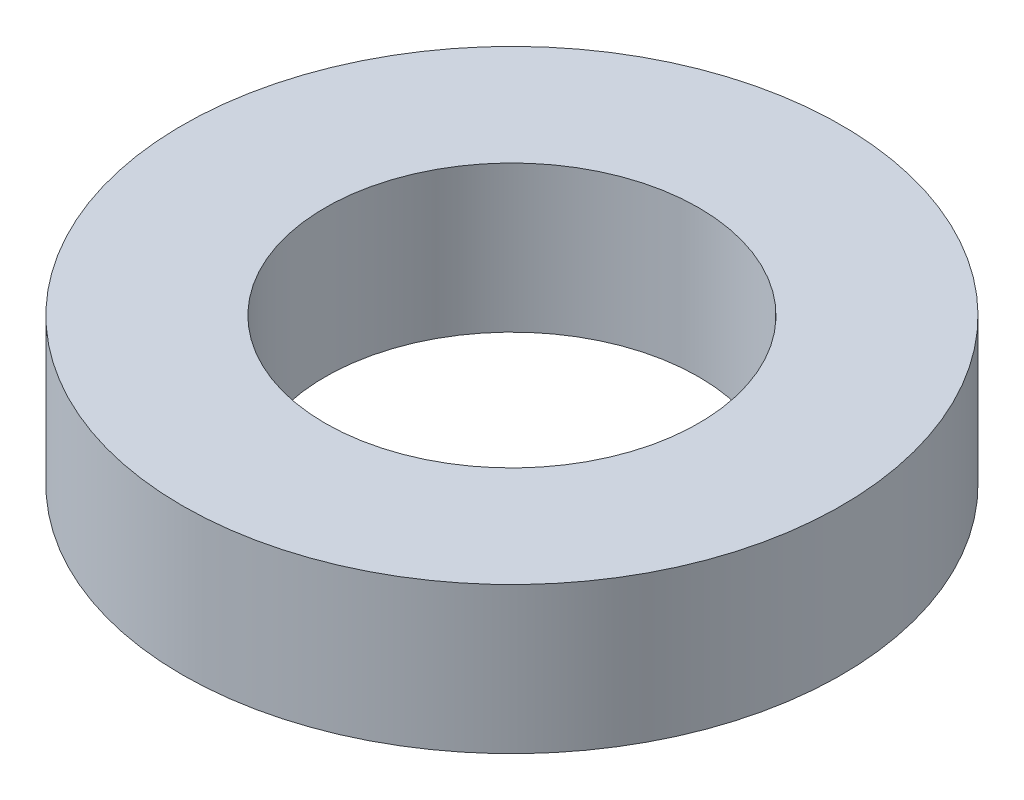
ISO-10303-21;
HEADER;
FILE_DESCRIPTION(('STEP AP214'),'2;1');
FILE_NAME('part.step','',(''),(''),'','','');
FILE_SCHEMA(('AUTOMOTIVE_DESIGN { 1 0 10303 214 1 1 1 1 }'));
ENDSEC;
DATA;
#1=APPLICATION_CONTEXT('core data for automotive mechanical design processes');
#2=APPLICATION_PROTOCOL_DEFINITION('international standard','automotive_design',2000,#1);
#3=PRODUCT_CONTEXT('',#1,'mechanical');
#4=PRODUCT('Part','Part','',(#3));
#5=PRODUCT_RELATED_PRODUCT_CATEGORY('part','',(#4));
#6=PRODUCT_DEFINITION_FORMATION('','',#4);
#7=PRODUCT_DEFINITION_CONTEXT('part definition',#1,'design');
#8=PRODUCT_DEFINITION('design','',#6,#7);
#9=PRODUCT_DEFINITION_SHAPE('','',#8);
#10=(LENGTH_UNIT() NAMED_UNIT(*) SI_UNIT(.MILLI.,.METRE.));
#11=(NAMED_UNIT(*) PLANE_ANGLE_UNIT() SI_UNIT($,.RADIAN.));
#12=(NAMED_UNIT(*) SI_UNIT($,.STERADIAN.) SOLID_ANGLE_UNIT());
#13=UNCERTAINTY_MEASURE_WITH_UNIT(LENGTH_MEASURE(1.E-05),#10,'distance_accuracy_value','');
#14=(GEOMETRIC_REPRESENTATION_CONTEXT(3) GLOBAL_UNCERTAINTY_ASSIGNED_CONTEXT((#13)) GLOBAL_UNIT_ASSIGNED_CONTEXT((#10,
#11,#12)) REPRESENTATION_CONTEXT('',''));
#15=CARTESIAN_POINT('',(0.,0.,0.));
#16=DIRECTION('',(0.,0.,1.));
#17=DIRECTION('',(1.,0.,0.));
#18=AXIS2_PLACEMENT_3D('',#15,#16,#17);
#19=CARTESIAN_POINT('',(0.,2.,0.));
#20=DIRECTION('',(0.,1.,0.));
#21=DIRECTION('',(0.,0.,1.));
#22=AXIS2_PLACEMENT_3D('',#19,#20,#21);
#23=PLANE('',#22);
#24=CARTESIAN_POINT('',(0.,2.,0.));
#25=DIRECTION('',(0.,1.,0.));
#26=DIRECTION('',(0.,0.,1.));
#27=AXIS2_PLACEMENT_3D('',#24,#25,#26);
#28=CIRCLE('',#27,4.5);
#29=CARTESIAN_POINT('',(0.,2.,4.5));
#30=VERTEX_POINT('',#29);
#31=EDGE_CURVE('E10',#30,#30,#28,.T.);
#32=ORIENTED_EDGE('',*,*,#31,.T.);
#33=EDGE_LOOP('',(#32));
#34=FACE_BOUND('',#33,.T.);
#35=CARTESIAN_POINT('',(0.,2.,0.));
#36=DIRECTION('',(0.,1.,0.));
#37=DIRECTION('',(0.,0.,1.));
#38=AXIS2_PLACEMENT_3D('',#35,#36,#37);
#39=CIRCLE('',#38,2.55);
#40=CARTESIAN_POINT('',(0.,2.,2.55));
#41=VERTEX_POINT('',#40);
#42=EDGE_CURVE('E50',#41,#41,#39,.T.);
#43=ORIENTED_EDGE('',*,*,#42,.F.);
#44=EDGE_LOOP('',(#43));
#45=FACE_BOUND('',#44,.T.);
#46=ADVANCED_FACE('F39',(#34,#45),#23,.T.);
#47=CARTESIAN_POINT('',(0.,0.,0.));
#48=DIRECTION('',(0.,1.,0.));
#49=DIRECTION('',(0.,0.,1.));
#50=AXIS2_PLACEMENT_3D('',#47,#48,#49);
#51=PLANE('',#50);
#52=CARTESIAN_POINT('',(0.,0.,0.));
#53=DIRECTION('',(0.,1.,0.));
#54=DIRECTION('',(0.,0.,1.));
#55=AXIS2_PLACEMENT_3D('',#52,#53,#54);
#56=CIRCLE('',#55,4.5);
#57=CARTESIAN_POINT('',(0.,0.,4.5));
#58=VERTEX_POINT('',#57);
#59=EDGE_CURVE('E43',#58,#58,#56,.T.);
#60=ORIENTED_EDGE('',*,*,#59,.F.);
#61=EDGE_LOOP('',(#60));
#62=FACE_BOUND('',#61,.T.);
#63=CARTESIAN_POINT('',(0.,0.,0.));
#64=DIRECTION('',(0.,1.,0.));
#65=DIRECTION('',(0.,0.,1.));
#66=AXIS2_PLACEMENT_3D('',#63,#64,#65);
#67=CIRCLE('',#66,2.55);
#68=CARTESIAN_POINT('',(0.,0.,2.55));
#69=VERTEX_POINT('',#68);
#70=EDGE_CURVE('E52',#69,#69,#67,.T.);
#71=ORIENTED_EDGE('',*,*,#70,.T.);
#72=EDGE_LOOP('',(#71));
#73=FACE_BOUND('',#72,.T.);
#74=ADVANCED_FACE('F62',(#62,#73),#51,.F.);
#75=CARTESIAN_POINT('',(0.,2.,0.));
#76=DIRECTION('',(0.,-1.,0.));
#77=DIRECTION('',(0.,0.,-1.));
#78=AXIS2_PLACEMENT_3D('',#75,#76,#77);
#79=CYLINDRICAL_SURFACE('',#78,4.5);
#80=ORIENTED_EDGE('',*,*,#31,.F.);
#81=EDGE_LOOP('',(#80));
#82=FACE_BOUND('',#81,.T.);
#83=ORIENTED_EDGE('',*,*,#59,.T.);
#84=EDGE_LOOP('',(#83));
#85=FACE_BOUND('',#84,.T.);
#86=ADVANCED_FACE('F41',(#82,#85),#79,.T.);
#87=CARTESIAN_POINT('',(0.,2.,0.));
#88=DIRECTION('',(0.,-1.,0.));
#89=DIRECTION('',(0.,0.,-1.));
#90=AXIS2_PLACEMENT_3D('',#87,#88,#89);
#91=CYLINDRICAL_SURFACE('',#90,2.55);
#92=ORIENTED_EDGE('',*,*,#42,.T.);
#93=EDGE_LOOP('',(#92));
#94=FACE_BOUND('',#93,.T.);
#95=ORIENTED_EDGE('',*,*,#70,.F.);
#96=EDGE_LOOP('',(#95));
#97=FACE_BOUND('',#96,.T.);
#98=ADVANCED_FACE('F58',(#94,#97),#91,.F.);
#99=CLOSED_SHELL('',(#46,#74,#86,#98));
#100=MANIFOLD_SOLID_BREP('B2',#99);
#101=ADVANCED_BREP_SHAPE_REPRESENTATION('',(#18,#100),#14);
#102=SHAPE_DEFINITION_REPRESENTATION(#9,#101);
ENDSEC;
END-ISO-10303-21;
